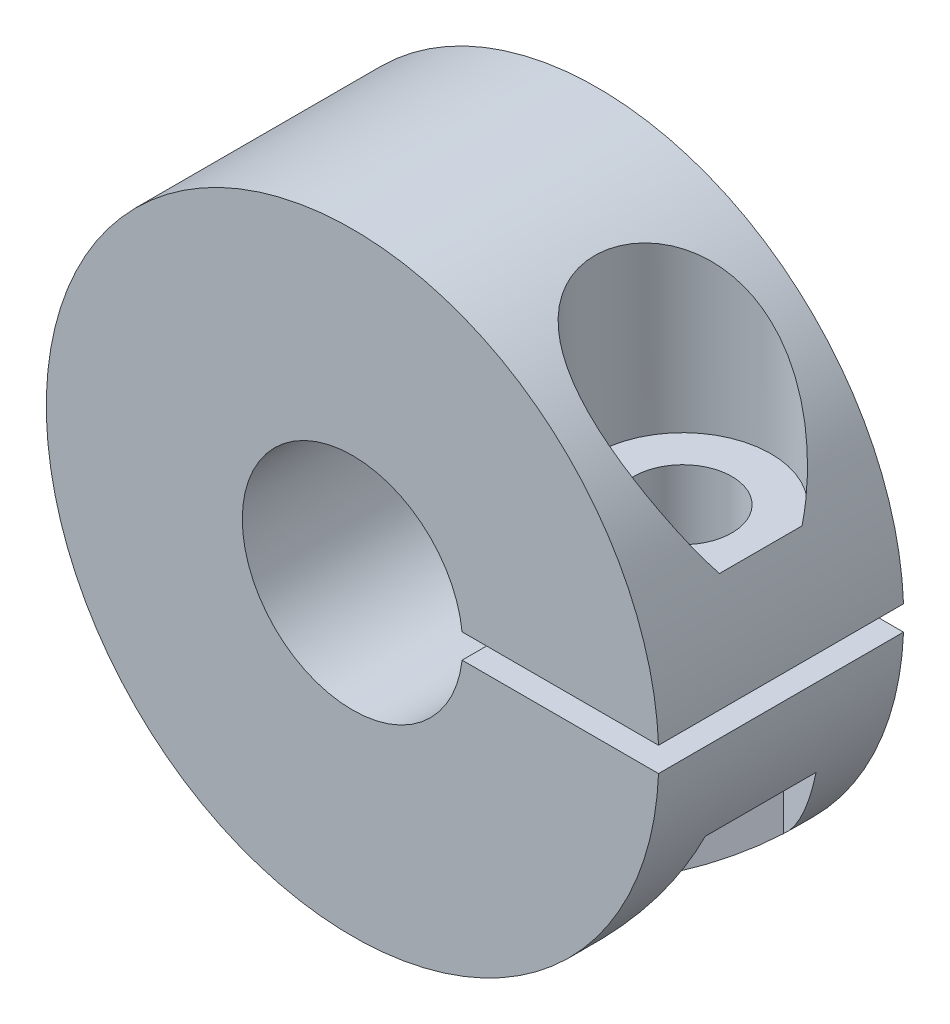
ISO-10303-21;
HEADER;
FILE_DESCRIPTION(('STEP AP214'),'2;1');
FILE_NAME('part.step','',(''),(''),'','','');
FILE_SCHEMA(('AUTOMOTIVE_DESIGN { 1 0 10303 214 1 1 1 1 }'));
ENDSEC;
DATA;
#1=APPLICATION_CONTEXT('core data for automotive mechanical design processes');
#2=APPLICATION_PROTOCOL_DEFINITION('international standard','automotive_design',2000,#1);
#3=PRODUCT_CONTEXT('',#1,'mechanical');
#4=PRODUCT('Part','Part','',(#3));
#5=PRODUCT_RELATED_PRODUCT_CATEGORY('part','',(#4));
#6=PRODUCT_DEFINITION_FORMATION('','',#4);
#7=PRODUCT_DEFINITION_CONTEXT('part definition',#1,'design');
#8=PRODUCT_DEFINITION('design','',#6,#7);
#9=PRODUCT_DEFINITION_SHAPE('','',#8);
#10=(LENGTH_UNIT() NAMED_UNIT(*) SI_UNIT(.MILLI.,.METRE.));
#11=(NAMED_UNIT(*) PLANE_ANGLE_UNIT() SI_UNIT($,.RADIAN.));
#12=(NAMED_UNIT(*) SI_UNIT($,.STERADIAN.) SOLID_ANGLE_UNIT());
#13=UNCERTAINTY_MEASURE_WITH_UNIT(LENGTH_MEASURE(1.E-05),#10,'distance_accuracy_value','');
#14=(GEOMETRIC_REPRESENTATION_CONTEXT(3) GLOBAL_UNCERTAINTY_ASSIGNED_CONTEXT((#13)) GLOBAL_UNIT_ASSIGNED_CONTEXT((#10,
#11,#12)) REPRESENTATION_CONTEXT('',''));
#15=CARTESIAN_POINT('',(0.,0.,0.));
#16=DIRECTION('',(0.,0.,1.));
#17=DIRECTION('',(1.,0.,0.));
#18=AXIS2_PLACEMENT_3D('',#15,#16,#17);
#19=CARTESIAN_POINT('',(0.,0.,10.));
#20=DIRECTION('',(0.,0.,-1.));
#21=DIRECTION('',(-1.,0.,0.));
#22=AXIS2_PLACEMENT_3D('',#19,#20,#21);
#23=CYLINDRICAL_SURFACE('',#22,12.5);
#24=CARTESIAN_POINT('',(0.,0.,2422.91582079382));
#25=DIRECTION('',(-0.999997920463144,0.,-0.00203937965780381));
#26=DIRECTION('',(0.00203937965780381,0.,-0.999997920463144));
#27=AXIS2_PLACEMENT_3D('',#24,#25,#26);
#28=ELLIPSE('',#27,6129.31483952388,12.5);
#29=CARTESIAN_POINT('',(4.92689345905386,-11.488068629806,7.04234939563284));
#30=VERTEX_POINT('',#29);
#31=CARTESIAN_POINT('',(4.9352532574542,-11.4844797568191,2.94317100879676));
#32=VERTEX_POINT('',#31);
#33=EDGE_CURVE('E142',#30,#32,#28,.F.);
#34=ORIENTED_EDGE('',*,*,#33,.F.);
#35=CARTESIAN_POINT('',(0.,0.,4.18439323499314));
#36=DIRECTION('',(-0.501765114823191,0.,0.865003913023791));
#37=DIRECTION('',(-0.865003913023791,0.,-0.501765114823191));
#38=AXIS2_PLACEMENT_3D('',#35,#36,#37);
#39=ELLIPSE('',#38,14.4508016805425,12.5);
#40=CARTESIAN_POINT('',(8.47270617749786,-9.19038900318097,9.09917838683608));
#41=VERTEX_POINT('',#40);
#42=EDGE_CURVE('E135',#41,#30,#39,.F.);
#43=ORIENTED_EDGE('',*,*,#42,.F.);
#44=CARTESIAN_POINT('',(0.,0.,13.9678858733121));
#45=DIRECTION('',(0.498232805639952,0.,0.867043292681595));
#46=DIRECTION('',(0.867043292681595,0.,-0.498232805639952));
#47=AXIS2_PLACEMENT_3D('',#44,#45,#46);
#48=ELLIPSE('',#47,14.4168118310909,12.5);
#49=CARTESIAN_POINT('',(11.6619037896906,-4.5,7.2665560858796));
#50=VERTEX_POINT('',#49);
#51=EDGE_CURVE('E114',#50,#41,#48,.F.);
#52=ORIENTED_EDGE('',*,*,#51,.F.);
#53=DIRECTION('',(0.,0.,-1.));
#54=VECTOR('',#53,1.);
#55=CARTESIAN_POINT('',(11.6619037896906,-4.5,10.));
#56=LINE('',#55,#54);
#57=CARTESIAN_POINT('',(11.6619037896906,-4.5,2.74108935265041));
#58=VERTEX_POINT('',#57);
#59=EDGE_CURVE('E124',#58,#50,#56,.F.);
#60=ORIENTED_EDGE('',*,*,#59,.F.);
#61=CARTESIAN_POINT('',(0.,0.,-4.02366211955498));
#62=DIRECTION('',(0.501765114823191,0.,-0.865003913023791));
#63=DIRECTION('',(-0.865003913023791,0.,-0.501765114823191));
#64=AXIS2_PLACEMENT_3D('',#61,#62,#63);
#65=ELLIPSE('',#64,14.4508016805425,12.5);
#66=CARTESIAN_POINT('',(8.48942577429852,-9.17494686756692,0.900821613163921));
#67=VERTEX_POINT('',#66);
#68=EDGE_CURVE('E48',#67,#58,#65,.F.);
#69=ORIENTED_EDGE('',*,*,#68,.F.);
#70=CARTESIAN_POINT('',(0.,0.,5.7791367532525));
#71=DIRECTION('',(-0.498232805639952,0.,-0.867043292681595));
#72=DIRECTION('',(0.867043292681595,0.,-0.498232805639952));
#73=AXIS2_PLACEMENT_3D('',#70,#71,#72);
#74=ELLIPSE('',#73,14.4168118310909,12.5);
#75=EDGE_CURVE('E137',#32,#67,#74,.F.);
#76=ORIENTED_EDGE('',*,*,#75,.F.);
#77=EDGE_LOOP('',(#34,#43,#52,#60,#69,#76));
#78=FACE_BOUND('',#77,.T.);
#79=CARTESIAN_POINT('',(0.,0.,0.));
#80=DIRECTION('',(0.,0.,1.));
#81=DIRECTION('',(1.,0.,0.));
#82=AXIS2_PLACEMENT_3D('',#79,#80,#81);
#83=CIRCLE('',#82,12.5);
#84=CARTESIAN_POINT('',(12.4899959967968,0.5,0.));
#85=VERTEX_POINT('',#84);
#86=CARTESIAN_POINT('',(12.4899959967968,-0.5,0.));
#87=VERTEX_POINT('',#86);
#88=EDGE_CURVE('E249',#85,#87,#83,.T.);
#89=ORIENTED_EDGE('',*,*,#88,.T.);
#90=DIRECTION('',(0.,0.,-1.));
#91=VECTOR('',#90,1.);
#92=CARTESIAN_POINT('',(12.4899959967968,-0.5,10.));
#93=LINE('',#92,#91);
#94=CARTESIAN_POINT('',(12.4899959967968,-0.5,10.));
#95=VERTEX_POINT('',#94);
#96=EDGE_CURVE('E242',#87,#95,#93,.F.);
#97=ORIENTED_EDGE('',*,*,#96,.T.);
#98=CARTESIAN_POINT('',(0.,0.,10.));
#99=DIRECTION('',(0.,0.,1.));
#100=DIRECTION('',(1.,0.,0.));
#101=AXIS2_PLACEMENT_3D('',#98,#99,#100);
#102=CIRCLE('',#101,12.5);
#103=CARTESIAN_POINT('',(12.4899959967968,0.5,10.));
#104=VERTEX_POINT('',#103);
#105=EDGE_CURVE('E252',#104,#95,#102,.T.);
#106=ORIENTED_EDGE('',*,*,#105,.F.);
#107=DIRECTION('',(0.,0.,-1.));
#108=VECTOR('',#107,1.);
#109=CARTESIAN_POINT('',(12.4899959967968,0.5,10.));
#110=LINE('',#109,#108);
#111=EDGE_CURVE('E237',#104,#85,#110,.T.);
#112=ORIENTED_EDGE('',*,*,#111,.T.);
#113=EDGE_LOOP('',(#89,#97,#106,#112));
#114=FACE_BOUND('',#113,.T.);
#115=CARTESIAN_POINT('',(11.6619037896906,4.5,6.68590355665687));
#116=CARTESIAN_POINT('',(11.6232312937179,4.60024640471985,6.7587966751429));
#117=CARTESIAN_POINT('',(11.5826816075723,4.70146008692517,6.82931418413315));
#118=CARTESIAN_POINT('',(11.4978770599653,4.90519446196676,6.96605859030262));
#119=CARTESIAN_POINT('',(11.4536229933021,5.00771487045529,7.0322864024821));
#120=CARTESIAN_POINT('',(11.3614186158335,5.21353145269208,7.16097587446819));
#121=CARTESIAN_POINT('',(11.3134664171379,5.31682799804539,7.22343558127736));
#122=CARTESIAN_POINT('',(11.2138846361096,5.52376490702866,7.34475184605532));
#123=CARTESIAN_POINT('',(11.1622547974534,5.62740529414271,7.40360815234233));
#124=CARTESIAN_POINT('',(11.000734092992,5.94048346808265,7.57609989603556));
#125=CARTESIAN_POINT('',(10.8851396057378,6.14999156342861,7.68436631619803));
#126=CARTESIAN_POINT('',(10.638714886934,6.56707129592836,7.88615318159714));
#127=CARTESIAN_POINT('',(10.5078887597863,6.77464343854569,7.97967758338374));
#128=CARTESIAN_POINT('',(10.2618431187233,7.14014415786093,8.13125659467173));
#129=CARTESIAN_POINT('',(10.1496835520319,7.29878632197094,8.19256502561245));
#130=CARTESIAN_POINT('',(9.91608336244311,7.61312160886827,8.304161075251));
#131=CARTESIAN_POINT('',(9.7946431195672,7.76881485208144,8.35444914488049));
#132=CARTESIAN_POINT('',(9.54305250562706,8.07585391395423,8.44236609590706));
#133=CARTESIAN_POINT('',(9.41293155228628,8.22721215645814,8.48003536396162));
#134=CARTESIAN_POINT('',(9.14404722317643,8.52505750333395,8.54110867546909));
#135=CARTESIAN_POINT('',(9.00528670858774,8.67154619597116,8.56451741420394));
#136=CARTESIAN_POINT('',(8.76003942218285,8.91812133479334,8.59065610361599));
#137=CARTESIAN_POINT('',(8.65544361193381,9.01967739219113,8.59734894511069));
#138=CARTESIAN_POINT('',(8.44266825768836,9.21914303299816,8.60136687540796));
#139=CARTESIAN_POINT('',(8.33448962171781,9.31705352717172,8.59869432003683));
#140=CARTESIAN_POINT('',(8.11526754182528,9.50860686688631,8.58305143459138));
#141=CARTESIAN_POINT('',(8.00422643286447,9.60225302851952,8.57008925584423));
#142=CARTESIAN_POINT('',(7.78008492514497,9.78474041966318,8.53291987077808));
#143=CARTESIAN_POINT('',(7.66698492818423,9.87358257353373,8.50871483640334));
#144=CARTESIAN_POINT('',(7.46189632885387,10.0291234661862,8.45402239574338));
#145=CARTESIAN_POINT('',(7.37006312221403,10.0967774077178,8.42566087508141));
#146=CARTESIAN_POINT('',(7.18656835414017,10.2281944265834,8.36061700494468));
#147=CARTESIAN_POINT('',(7.09490676020431,10.2919583327447,8.32393643587405));
#148=CARTESIAN_POINT('',(6.91259499057676,10.4152842336333,8.24189636547583));
#149=CARTESIAN_POINT('',(6.82194505578384,10.4748452448015,8.19653484179464));
#150=CARTESIAN_POINT('',(6.64272350583518,10.5894064753452,8.09693398226258));
#151=CARTESIAN_POINT('',(6.55415085977593,10.6444089928581,8.04269916135509));
#152=CARTESIAN_POINT('',(6.37941405986105,10.7500505515716,7.92476666615139));
#153=CARTESIAN_POINT('',(6.29327613151072,10.8006494056056,7.86099389254914));
#154=CARTESIAN_POINT('',(6.1254351592536,10.8967147172416,7.72446300032016));
#155=CARTESIAN_POINT('',(6.0437299724286,10.9421836664778,7.6517092800816));
#156=CARTESIAN_POINT('',(5.88596535763091,11.0278497729776,7.49752189058395));
#157=CARTESIAN_POINT('',(5.80990467685962,11.0680481015839,7.41609015724375));
#158=CARTESIAN_POINT('',(5.66463614294766,11.1430957900918,7.24506244375442));
#159=CARTESIAN_POINT('',(5.59542722808537,11.1779459791812,7.15546773265168));
#160=CARTESIAN_POINT('',(5.47362972963911,11.238032009062,6.98118451473635));
#161=CARTESIAN_POINT('',(5.420053364648,11.2639297650244,6.89741181794328));
#162=CARTESIAN_POINT('',(5.31960528829054,11.3117148995746,6.72485626237021));
#163=CARTESIAN_POINT('',(5.27273287715814,11.3336026967934,6.63607392785275));
#164=CARTESIAN_POINT('',(5.18630585892167,11.3734118299133,6.45419768286399));
#165=CARTESIAN_POINT('',(5.14674906445962,11.3913343517413,6.36110507160171));
#166=CARTESIAN_POINT('',(5.07544401354512,11.4232830826403,6.17132932589946));
#167=CARTESIAN_POINT('',(5.04369547031448,11.4373094348108,6.07464632347604));
#168=CARTESIAN_POINT('',(4.99041137022116,11.4606534600302,5.88558888233113));
#169=CARTESIAN_POINT('',(4.96830345791456,11.4702382104215,5.79340817899431));
#170=CARTESIAN_POINT('',(4.93138863731829,11.4861573346354,5.60728567554286));
#171=CARTESIAN_POINT('',(4.9165842836902,11.4924905711649,5.51334327112447));
#172=CARTESIAN_POINT('',(4.89445862980848,11.5019312960951,5.32446671608708));
#173=CARTESIAN_POINT('',(4.88713323928058,11.5050405477204,5.22953313627768));
#174=CARTESIAN_POINT('',(4.88002018994209,11.5080581980166,5.03932383838682));
#175=CARTESIAN_POINT('',(4.88023529383763,11.5079654235208,4.94404800769433));
#176=CARTESIAN_POINT('',(4.89207893088826,11.5029449453325,4.66254028979617));
#177=CARTESIAN_POINT('',(4.91445488335333,11.493465965856,4.47670297684394));
#178=CARTESIAN_POINT('',(4.98737716685351,11.4620066304837,4.1118561656539));
#179=CARTESIAN_POINT('',(5.03792208680611,11.4400269007931,3.93284632588386));
#180=CARTESIAN_POINT('',(5.16513652837884,11.3831541839997,3.58624101399508));
#181=CARTESIAN_POINT('',(5.24184277804123,11.3482430364422,3.41866198874061));
#182=CARTESIAN_POINT('',(5.4180914192577,11.2651557130213,3.09962816362882));
#183=CARTESIAN_POINT('',(5.51763352286506,11.2169797044185,2.94817316049227));
#184=CARTESIAN_POINT('',(5.73781024020355,11.1059903252737,2.66164165661956));
#185=CARTESIAN_POINT('',(5.85886880464897,11.0428721815045,2.52701001465986));
#186=CARTESIAN_POINT('',(6.11537302110823,10.9029140375703,2.2805963067868));
#187=CARTESIAN_POINT('',(6.2508215152469,10.8260713246453,2.16881876753647));
#188=CARTESIAN_POINT('',(6.5402149913933,10.6539076670761,1.96244247607231));
#189=CARTESIAN_POINT('',(6.69479097284539,10.5576982417363,1.86947846710403));
#190=CARTESIAN_POINT('',(7.00871356488659,10.3519637204885,1.7101362315639));
#191=CARTESIAN_POINT('',(7.16806268917522,10.242431512005,1.64377228777227));
#192=CARTESIAN_POINT('',(7.43945951867577,10.0460778037368,1.55194430120045));
#193=CARTESIAN_POINT('',(7.55154189592949,9.96213520032899,1.52018825990191));
#194=CARTESIAN_POINT('',(7.77448053149212,9.78914416436897,1.46816816507332));
#195=CARTESIAN_POINT('',(7.88533639539192,9.70009414326777,1.44790770856725));
#196=CARTESIAN_POINT('',(8.10487008280264,9.51743162969728,1.41799382693765));
#197=CARTESIAN_POINT('',(8.21354533427201,9.423814150513,1.40835227890941));
#198=CARTESIAN_POINT('',(8.42784895318468,9.23265915439719,1.39879520257584));
#199=CARTESIAN_POINT('',(8.53347648534612,9.13512058002365,1.39888231572764));
#200=CARTESIAN_POINT('',(8.77945992629224,8.89998492513706,1.4095662660406));
#201=CARTESIAN_POINT('',(8.91823202735549,8.76089919433219,1.42403324797565));
#202=CARTESIAN_POINT('',(9.18800190462924,8.47755470466015,1.46744857500993));
#203=CARTESIAN_POINT('',(9.31899711182666,8.3332942613511,1.49640167599254));
#204=CARTESIAN_POINT('',(9.57313809853819,8.04007520620417,1.56709432873956));
#205=CARTESIAN_POINT('',(9.69625187570861,7.89110070942893,1.60888245270859));
#206=CARTESIAN_POINT('',(9.93381154593368,7.58987503723201,1.70365601953182));
#207=CARTESIAN_POINT('',(10.0482567789151,7.43762361341736,1.75664231391766));
#208=CARTESIAN_POINT('',(10.3227930435553,7.05475414132677,1.90119118212424));
#209=CARTESIAN_POINT('',(10.4775073918132,6.82257455072235,1.99888049744066));
#210=CARTESIAN_POINT('',(10.7675933216357,6.35489469368583,2.21353117485664));
#211=CARTESIAN_POINT('',(10.9029521298729,6.11939234604474,2.33050515490493));
#212=CARTESIAN_POINT('',(11.0908106679689,5.76726547261708,2.5186831336399));
#213=CARTESIAN_POINT('',(11.1505733619897,5.65080129953041,2.58308780124004));
#214=CARTESIAN_POINT('',(11.2654553344997,5.41814885302232,2.71637921865045));
#215=CARTESIAN_POINT('',(11.3205749789576,5.30196055855883,2.78526561444764));
#216=CARTESIAN_POINT('',(11.4261131431545,5.07051164036811,2.92767129837597));
#217=CARTESIAN_POINT('',(11.4765375253813,4.95525002854132,3.00118461169282));
#218=CARTESIAN_POINT('',(11.5486816031836,4.7834938422957,3.11538852375103));
#219=CARTESIAN_POINT('',(11.5721505986493,4.72642321301662,3.15411786983847));
#220=CARTESIAN_POINT('',(11.617912575127,4.612793563538,3.23300617090152));
#221=CARTESIAN_POINT('',(11.6402054549511,4.55623458770459,3.27316524838875));
#222=CARTESIAN_POINT('',(11.6619037896906,4.5,3.31409644334312));
#223=B_SPLINE_CURVE_WITH_KNOTS('',3,(#115,#116,#117,#118,#119,#120,#121,#122,#123,#124,#125,
#126,#127,#128,#129,#130,#131,#132,#133,#134,#135,#136,#137,#138,#139,#140,#141,#142,#143,#144,
#145,#146,#147,#148,#149,#150,#151,#152,#153,#154,#155,#156,#157,#158,#159,#160,#161,#162,#163,
#164,#165,#166,#167,#168,#169,#170,#171,#172,#173,#174,#175,#176,#177,#178,#179,#180,#181,#182,
#183,#184,#185,#186,#187,#188,#189,#190,#191,#192,#193,#194,#195,#196,#197,#198,#199,#200,#201,
#202,#203,#204,#205,#206,#207,#208,#209,#210,#211,#212,#213,#214,#215,#216,#217,#218,#219,#220,
#221,#222),.UNSPECIFIED.,.F.,.F.,(4,2,2,2,2,2,2,2,2,2,2,2,2,2,2,2,2,2,2,2,2,2,2,2,2,2,2,2,2,2,2,
2,2,2,2,2,2,2,2,2,2,2,2,2,2,2,2,2,2,2,2,2,2,4),(0.,0.389438990859378,0.778794638232663,
1.16835038374078,1.55793330704584,2.34494826786649,3.13175164399498,3.74246673380024,
4.35315682966884,4.9618733008379,5.57038924352258,6.00786942473474,6.44523956754302,
6.88226357585777,7.31920319304537,7.67148459416518,8.02369067268008,8.37597890278662,
8.72808843462859,9.08313256231644,9.43800349311346,9.79279542323642,10.1475322899187,
10.4553998128853,10.7632351768127,11.0709783491107,11.3787102170579,11.664197702723,
11.9497849764163,12.2352159775063,12.5207515566473,13.0801097244803,13.6394398746167,
14.1995585261762,14.7596701153558,15.3323762061796,15.9051956220144,16.5160725874819,
17.1272771224747,17.5574999662293,17.9878573546547,18.4186956042887,18.8496508323553,
19.4397901891548,20.0301234196491,20.6227187920027,21.215359242737,22.1007372755753,
22.9866969269262,23.4242464209566,23.8617613946819,24.2987225504884,24.5172645516205,
24.7358253245862),.UNSPECIFIED.);
#224=CARTESIAN_POINT('',(11.6619037896906,4.5,6.68590355665687));
#225=VERTEX_POINT('',#224);
#226=CARTESIAN_POINT('',(11.6619037896906,4.5,3.31409644334313));
#227=VERTEX_POINT('',#226);
#228=EDGE_CURVE('E163',#225,#227,#223,.T.);
#229=ORIENTED_EDGE('',*,*,#228,.T.);
#230=DIRECTION('',(0.,0.,-1.));
#231=VECTOR('',#230,1.);
#232=CARTESIAN_POINT('',(11.6619037896906,4.5,10.));
#233=LINE('',#232,#231);
#234=EDGE_CURVE('E222',#227,#225,#233,.F.);
#235=ORIENTED_EDGE('',*,*,#234,.T.);
#236=EDGE_LOOP('',(#229,#235));
#237=FACE_BOUND('',#236,.T.);
#238=ADVANCED_FACE('F33',(#78,#114,#237),#23,.T.);
#239=CARTESIAN_POINT('',(8.48106597589819,-12.5,5.));
#240=DIRECTION('',(0.,1.,0.));
#241=DIRECTION('',(0.,0.,1.));
#242=AXIS2_PLACEMENT_3D('',#239,#240,#241);
#243=CYLINDRICAL_SURFACE('',#242,2.);
#244=CARTESIAN_POINT('',(8.48106597589819,0.5,5.));
#245=DIRECTION('',(0.,1.,0.));
#246=DIRECTION('',(0.,0.,1.));
#247=AXIS2_PLACEMENT_3D('',#244,#245,#246);
#248=CIRCLE('',#247,2.);
#249=CARTESIAN_POINT('',(8.48106597589819,0.5,7.));
#250=VERTEX_POINT('',#249);
#251=EDGE_CURVE('E221',#250,#250,#248,.T.);
#252=ORIENTED_EDGE('',*,*,#251,.F.);
#253=EDGE_LOOP('',(#252));
#254=FACE_BOUND('',#253,.T.);
#255=CARTESIAN_POINT('',(8.48106597589819,4.5,5.));
#256=DIRECTION('',(0.,1.,0.));
#257=DIRECTION('',(0.,0.,1.));
#258=AXIS2_PLACEMENT_3D('',#255,#256,#257);
#259=CIRCLE('',#258,2.);
#260=CARTESIAN_POINT('',(8.48106597589819,4.5,7.));
#261=VERTEX_POINT('',#260);
#262=EDGE_CURVE('E129',#261,#261,#259,.T.);
#263=ORIENTED_EDGE('',*,*,#262,.T.);
#264=EDGE_LOOP('',(#263));
#265=FACE_BOUND('',#264,.T.);
#266=ADVANCED_FACE('F194',(#254,#265),#243,.F.);
#267=CARTESIAN_POINT('',(0.,0.,10.));
#268=DIRECTION('',(0.,0.,1.));
#269=DIRECTION('',(1.,0.,0.));
#270=AXIS2_PLACEMENT_3D('',#267,#268,#269);
#271=PLANE('',#270);
#272=DIRECTION('',(1.,0.,0.));
#273=VECTOR('',#272,1.);
#274=CARTESIAN_POINT('',(3.50590402803037,-0.5,10.));
#275=LINE('',#274,#273);
#276=CARTESIAN_POINT('',(4.47213595499958,-0.5,10.));
#277=VERTEX_POINT('',#276);
#278=EDGE_CURVE('E234',#277,#95,#275,.T.);
#279=ORIENTED_EDGE('',*,*,#278,.F.);
#280=CARTESIAN_POINT('',(0.,0.,10.));
#281=DIRECTION('',(0.,0.,1.));
#282=DIRECTION('',(1.,0.,0.));
#283=AXIS2_PLACEMENT_3D('',#280,#281,#282);
#284=CIRCLE('',#283,4.5);
#285=CARTESIAN_POINT('',(4.47213595499958,0.5,10.));
#286=VERTEX_POINT('',#285);
#287=EDGE_CURVE('E246',#286,#277,#284,.T.);
#288=ORIENTED_EDGE('',*,*,#287,.F.);
#289=DIRECTION('',(-1.,0.,0.));
#290=VECTOR('',#289,1.);
#291=CARTESIAN_POINT('',(3.50590402803037,0.5,10.));
#292=LINE('',#291,#290);
#293=EDGE_CURVE('E224',#104,#286,#292,.T.);
#294=ORIENTED_EDGE('',*,*,#293,.F.);
#295=ORIENTED_EDGE('',*,*,#105,.T.);
#296=EDGE_LOOP('',(#279,#288,#294,#295));
#297=FACE_BOUND('',#296,.T.);
#298=ADVANCED_FACE('F198',(#297),#271,.T.);
#299=CARTESIAN_POINT('',(0.,0.,0.));
#300=DIRECTION('',(0.,0.,1.));
#301=DIRECTION('',(1.,0.,0.));
#302=AXIS2_PLACEMENT_3D('',#299,#300,#301);
#303=PLANE('',#302);
#304=CARTESIAN_POINT('',(0.,0.,0.));
#305=DIRECTION('',(0.,0.,1.));
#306=DIRECTION('',(1.,0.,0.));
#307=AXIS2_PLACEMENT_3D('',#304,#305,#306);
#308=CIRCLE('',#307,4.5);
#309=CARTESIAN_POINT('',(4.47213595499958,0.5,0.));
#310=VERTEX_POINT('',#309);
#311=CARTESIAN_POINT('',(4.47213595499958,-0.5,0.));
#312=VERTEX_POINT('',#311);
#313=EDGE_CURVE('E245',#310,#312,#308,.T.);
#314=ORIENTED_EDGE('',*,*,#313,.T.);
#315=DIRECTION('',(1.,0.,0.));
#316=VECTOR('',#315,1.);
#317=CARTESIAN_POINT('',(3.50590402803037,-0.5,0.));
#318=LINE('',#317,#316);
#319=EDGE_CURVE('E233',#312,#87,#318,.T.);
#320=ORIENTED_EDGE('',*,*,#319,.T.);
#321=ORIENTED_EDGE('',*,*,#88,.F.);
#322=DIRECTION('',(-1.,0.,0.));
#323=VECTOR('',#322,1.);
#324=CARTESIAN_POINT('',(3.50590402803037,0.5,0.));
#325=LINE('',#324,#323);
#326=EDGE_CURVE('E230',#85,#310,#325,.T.);
#327=ORIENTED_EDGE('',*,*,#326,.T.);
#328=EDGE_LOOP('',(#314,#320,#321,#327));
#329=FACE_BOUND('',#328,.T.);
#330=ADVANCED_FACE('F203',(#329),#303,.F.);
#331=CARTESIAN_POINT('',(0.,0.,10.));
#332=DIRECTION('',(0.,0.,-1.));
#333=DIRECTION('',(-1.,0.,0.));
#334=AXIS2_PLACEMENT_3D('',#331,#332,#333);
#335=CYLINDRICAL_SURFACE('',#334,4.5);
#336=DIRECTION('',(0.,0.,-1.));
#337=VECTOR('',#336,1.);
#338=CARTESIAN_POINT('',(4.47213595499958,-0.5,10.));
#339=LINE('',#338,#337);
#340=EDGE_CURVE('E11',#312,#277,#339,.F.);
#341=ORIENTED_EDGE('',*,*,#340,.F.);
#342=ORIENTED_EDGE('',*,*,#313,.F.);
#343=DIRECTION('',(0.,0.,-1.));
#344=VECTOR('',#343,1.);
#345=CARTESIAN_POINT('',(4.47213595499958,0.5,10.));
#346=LINE('',#345,#344);
#347=EDGE_CURVE('E41',#286,#310,#346,.T.);
#348=ORIENTED_EDGE('',*,*,#347,.F.);
#349=ORIENTED_EDGE('',*,*,#287,.T.);
#350=EDGE_LOOP('',(#341,#342,#348,#349));
#351=FACE_BOUND('',#350,.T.);
#352=ADVANCED_FACE('F266',(#351),#335,.F.);
#353=CARTESIAN_POINT('',(3.50590402803037,0.5,0.));
#354=DIRECTION('',(0.,1.,0.));
#355=DIRECTION('',(0.,0.,1.));
#356=AXIS2_PLACEMENT_3D('',#353,#354,#355);
#357=PLANE('',#356);
#358=ORIENTED_EDGE('',*,*,#251,.T.);
#359=EDGE_LOOP('',(#358));
#360=FACE_BOUND('',#359,.T.);
#361=ORIENTED_EDGE('',*,*,#293,.T.);
#362=ORIENTED_EDGE('',*,*,#347,.T.);
#363=ORIENTED_EDGE('',*,*,#326,.F.);
#364=ORIENTED_EDGE('',*,*,#111,.F.);
#365=EDGE_LOOP('',(#361,#362,#363,#364));
#366=FACE_BOUND('',#365,.T.);
#367=ADVANCED_FACE('F215',(#360,#366),#357,.F.);
#368=CARTESIAN_POINT('',(3.50590402803037,-0.5,0.));
#369=DIRECTION('',(0.,-1.,0.));
#370=DIRECTION('',(0.,0.,-1.));
#371=AXIS2_PLACEMENT_3D('',#368,#369,#370);
#372=PLANE('',#371);
#373=CARTESIAN_POINT('',(8.48106597589819,-0.5,5.));
#374=DIRECTION('',(0.,-1.,0.));
#375=DIRECTION('',(0.,0.,-1.));
#376=AXIS2_PLACEMENT_3D('',#373,#374,#375);
#377=CIRCLE('',#376,2.);
#378=CARTESIAN_POINT('',(8.48106597589819,-0.5,3.));
#379=VERTEX_POINT('',#378);
#380=EDGE_CURVE('E36',#379,#379,#377,.T.);
#381=ORIENTED_EDGE('',*,*,#380,.T.);
#382=EDGE_LOOP('',(#381));
#383=FACE_BOUND('',#382,.T.);
#384=ORIENTED_EDGE('',*,*,#319,.F.);
#385=ORIENTED_EDGE('',*,*,#340,.T.);
#386=ORIENTED_EDGE('',*,*,#278,.T.);
#387=ORIENTED_EDGE('',*,*,#96,.F.);
#388=EDGE_LOOP('',(#384,#385,#386,#387));
#389=FACE_BOUND('',#388,.T.);
#390=ADVANCED_FACE('F210',(#383,#389),#372,.F.);
#391=CARTESIAN_POINT('',(8.48106597589819,-4.5,5.));
#392=DIRECTION('',(0.,1.,0.));
#393=DIRECTION('',(0.,0.,1.));
#394=AXIS2_PLACEMENT_3D('',#391,#392,#393);
#395=CIRCLE('',#394,2.);
#396=CARTESIAN_POINT('',(8.48106597589819,-4.5,7.));
#397=VERTEX_POINT('',#396);
#398=EDGE_CURVE('E130',#397,#397,#395,.T.);
#399=ORIENTED_EDGE('',*,*,#398,.F.);
#400=EDGE_LOOP('',(#399));
#401=FACE_BOUND('',#400,.T.);
#402=ORIENTED_EDGE('',*,*,#380,.F.);
#403=EDGE_LOOP('',(#402));
#404=FACE_BOUND('',#403,.T.);
#405=ADVANCED_FACE('F190',(#401,#404),#243,.F.);
#406=CARTESIAN_POINT('',(8.48106597589819,12.501,5.));
#407=DIRECTION('',(0.,-1.,0.));
#408=DIRECTION('',(0.,0.,-1.));
#409=AXIS2_PLACEMENT_3D('',#406,#407,#408);
#410=CYLINDRICAL_SURFACE('',#409,3.6);
#411=CARTESIAN_POINT('',(8.48106597589819,4.5,5.));
#412=DIRECTION('',(0.,1.,0.));
#413=DIRECTION('',(0.,0.,1.));
#414=AXIS2_PLACEMENT_3D('',#411,#412,#413);
#415=CIRCLE('',#414,3.6);
#416=EDGE_CURVE('E55',#227,#225,#415,.T.);
#417=ORIENTED_EDGE('',*,*,#416,.F.);
#418=ORIENTED_EDGE('',*,*,#228,.F.);
#419=EDGE_LOOP('',(#417,#418));
#420=FACE_BOUND('',#419,.T.);
#421=ADVANCED_FACE('F173',(#420),#410,.F.);
#422=CARTESIAN_POINT('',(8.48106597589819,4.5,5.));
#423=DIRECTION('',(0.,1.,0.));
#424=DIRECTION('',(0.,0.,1.));
#425=AXIS2_PLACEMENT_3D('',#422,#423,#424);
#426=PLANE('',#425);
#427=ORIENTED_EDGE('',*,*,#262,.F.);
#428=EDGE_LOOP('',(#427));
#429=FACE_BOUND('',#428,.T.);
#430=ORIENTED_EDGE('',*,*,#416,.T.);
#431=ORIENTED_EDGE('',*,*,#234,.F.);
#432=EDGE_LOOP('',(#430,#431));
#433=FACE_BOUND('',#432,.T.);
#434=ADVANCED_FACE('F181',(#429,#433),#426,.T.);
#435=CARTESIAN_POINT('',(4.92689345905386,-12.501,7.04234939563284));
#436=DIRECTION('',(-0.501765114823191,0.,0.865003913023791));
#437=DIRECTION('',(0.865003913023791,0.,0.501765114823191));
#438=AXIS2_PLACEMENT_3D('',#435,#436,#437);
#439=PLANE('',#438);
#440=ORIENTED_EDGE('',*,*,#42,.T.);
#441=DIRECTION('',(0.,1.,0.));
#442=VECTOR('',#441,1.);
#443=CARTESIAN_POINT('',(4.92689345905386,-12.501,7.04234939563284));
#444=LINE('',#443,#442);
#445=CARTESIAN_POINT('',(4.92689345905386,-4.5,7.04234939563284));
#446=VERTEX_POINT('',#445);
#447=EDGE_CURVE('E154',#30,#446,#444,.T.);
#448=ORIENTED_EDGE('',*,*,#447,.T.);
#449=DIRECTION('',(0.865003913023791,0.,0.501765114823191));
#450=VECTOR('',#449,1.);
#451=CARTESIAN_POINT('',(4.92689345905386,-4.5,7.04234939563284));
#452=LINE('',#451,#450);
#453=CARTESIAN_POINT('',(8.47270617749786,-4.5,9.09917838683608));
#454=VERTEX_POINT('',#453);
#455=EDGE_CURVE('E121',#446,#454,#452,.T.);
#456=ORIENTED_EDGE('',*,*,#455,.T.);
#457=DIRECTION('',(0.,1.,0.));
#458=VECTOR('',#457,1.);
#459=CARTESIAN_POINT('',(8.47270617749786,-12.501,9.09917838683608));
#460=LINE('',#459,#458);
#461=EDGE_CURVE('E116',#41,#454,#460,.T.);
#462=ORIENTED_EDGE('',*,*,#461,.F.);
#463=EDGE_LOOP('',(#440,#448,#456,#462));
#464=FACE_BOUND('',#463,.T.);
#465=ADVANCED_FACE('F179',(#464),#439,.F.);
#466=CARTESIAN_POINT('',(4.9352532574542,-12.501,2.94317100879676));
#467=DIRECTION('',(-0.999997920463144,0.,-0.00203937965780381));
#468=DIRECTION('',(-0.00203937965780381,0.,0.999997920463144));
#469=AXIS2_PLACEMENT_3D('',#466,#467,#468);
#470=PLANE('',#469);
#471=ORIENTED_EDGE('',*,*,#33,.T.);
#472=DIRECTION('',(0.,1.,0.));
#473=VECTOR('',#472,1.);
#474=CARTESIAN_POINT('',(4.9352532574542,-12.501,2.94317100879676));
#475=LINE('',#474,#473);
#476=CARTESIAN_POINT('',(4.9352532574542,-4.5,2.94317100879676));
#477=VERTEX_POINT('',#476);
#478=EDGE_CURVE('E156',#32,#477,#475,.T.);
#479=ORIENTED_EDGE('',*,*,#478,.T.);
#480=DIRECTION('',(-0.00203937965780381,0.,0.999997920463144));
#481=VECTOR('',#480,1.);
#482=CARTESIAN_POINT('',(4.9352532574542,-4.5,2.94317100879676));
#483=LINE('',#482,#481);
#484=EDGE_CURVE('E151',#477,#446,#483,.T.);
#485=ORIENTED_EDGE('',*,*,#484,.T.);
#486=ORIENTED_EDGE('',*,*,#447,.F.);
#487=EDGE_LOOP('',(#471,#479,#485,#486));
#488=FACE_BOUND('',#487,.T.);
#489=ADVANCED_FACE('F188',(#488),#470,.F.);
#490=CARTESIAN_POINT('',(8.48942577429852,-12.501,0.900821613163921));
#491=DIRECTION('',(-0.498232805639952,0.,-0.867043292681595));
#492=DIRECTION('',(-0.867043292681595,0.,0.498232805639952));
#493=AXIS2_PLACEMENT_3D('',#490,#491,#492);
#494=PLANE('',#493);
#495=ORIENTED_EDGE('',*,*,#75,.T.);
#496=DIRECTION('',(0.,1.,0.));
#497=VECTOR('',#496,1.);
#498=CARTESIAN_POINT('',(8.48942577429852,-12.501,0.900821613163921));
#499=LINE('',#498,#497);
#500=CARTESIAN_POINT('',(8.48942577429852,-4.5,0.900821613163921));
#501=VERTEX_POINT('',#500);
#502=EDGE_CURVE('E158',#67,#501,#499,.T.);
#503=ORIENTED_EDGE('',*,*,#502,.T.);
#504=DIRECTION('',(-0.867043292681595,0.,0.498232805639952));
#505=VECTOR('',#504,1.);
#506=CARTESIAN_POINT('',(8.48942577429852,-4.5,0.900821613163921));
#507=LINE('',#506,#505);
#508=EDGE_CURVE('E148',#501,#477,#507,.T.);
#509=ORIENTED_EDGE('',*,*,#508,.T.);
#510=ORIENTED_EDGE('',*,*,#478,.F.);
#511=EDGE_LOOP('',(#495,#503,#509,#510));
#512=FACE_BOUND('',#511,.T.);
#513=ADVANCED_FACE('F336',(#512),#494,.F.);
#514=CARTESIAN_POINT('',(12.0352384927425,-12.501,2.95765060436716));
#515=DIRECTION('',(0.501765114823191,0.,-0.865003913023791));
#516=DIRECTION('',(-0.865003913023791,0.,-0.501765114823191));
#517=AXIS2_PLACEMENT_3D('',#514,#515,#516);
#518=PLANE('',#517);
#519=ORIENTED_EDGE('',*,*,#68,.T.);
#520=DIRECTION('',(-0.865003913023791,0.,-0.501765114823191));
#521=VECTOR('',#520,1.);
#522=CARTESIAN_POINT('',(12.0352384927425,-4.5,2.95765060436716));
#523=LINE('',#522,#521);
#524=EDGE_CURVE('E120',#58,#501,#523,.T.);
#525=ORIENTED_EDGE('',*,*,#524,.T.);
#526=ORIENTED_EDGE('',*,*,#502,.F.);
#527=EDGE_LOOP('',(#519,#525,#526));
#528=FACE_BOUND('',#527,.T.);
#529=ADVANCED_FACE('F345',(#528),#518,.F.);
#530=CARTESIAN_POINT('',(8.47270617749786,-12.501,9.09917838683608));
#531=DIRECTION('',(0.498232805639952,0.,0.867043292681595));
#532=DIRECTION('',(0.867043292681595,0.,-0.498232805639952));
#533=AXIS2_PLACEMENT_3D('',#530,#531,#532);
#534=PLANE('',#533);
#535=ORIENTED_EDGE('',*,*,#51,.T.);
#536=ORIENTED_EDGE('',*,*,#461,.T.);
#537=DIRECTION('',(0.867043292681595,0.,-0.498232805639952));
#538=VECTOR('',#537,1.);
#539=CARTESIAN_POINT('',(8.47270617749786,-4.5,9.09917838683608));
#540=LINE('',#539,#538);
#541=EDGE_CURVE('E110',#454,#50,#540,.T.);
#542=ORIENTED_EDGE('',*,*,#541,.T.);
#543=EDGE_LOOP('',(#535,#536,#542));
#544=FACE_BOUND('',#543,.T.);
#545=ADVANCED_FACE('F112',(#544),#534,.F.);
#546=CARTESIAN_POINT('',(0.,-4.5,0.));
#547=DIRECTION('',(0.,1.,0.));
#548=DIRECTION('',(0.,0.,1.));
#549=AXIS2_PLACEMENT_3D('',#546,#547,#548);
#550=PLANE('',#549);
#551=ORIENTED_EDGE('',*,*,#59,.T.);
#552=ORIENTED_EDGE('',*,*,#541,.F.);
#553=ORIENTED_EDGE('',*,*,#455,.F.);
#554=ORIENTED_EDGE('',*,*,#484,.F.);
#555=ORIENTED_EDGE('',*,*,#508,.F.);
#556=ORIENTED_EDGE('',*,*,#524,.F.);
#557=EDGE_LOOP('',(#551,#552,#553,#554,#555,#556));
#558=FACE_BOUND('',#557,.T.);
#559=ORIENTED_EDGE('',*,*,#398,.T.);
#560=EDGE_LOOP('',(#559));
#561=FACE_BOUND('',#560,.T.);
#562=ADVANCED_FACE('F125',(#558,#561),#550,.F.);
#563=CLOSED_SHELL('',(#238,#266,#298,#330,#352,#367,#390,#405,#421,#434,#465,#489,#513,#529,
#545,#562));
#564=MANIFOLD_SOLID_BREP('B2',#563);
#565=ADVANCED_BREP_SHAPE_REPRESENTATION('',(#18,#564),#14);
#566=SHAPE_DEFINITION_REPRESENTATION(#9,#565);
ENDSEC;
END-ISO-10303-21;
